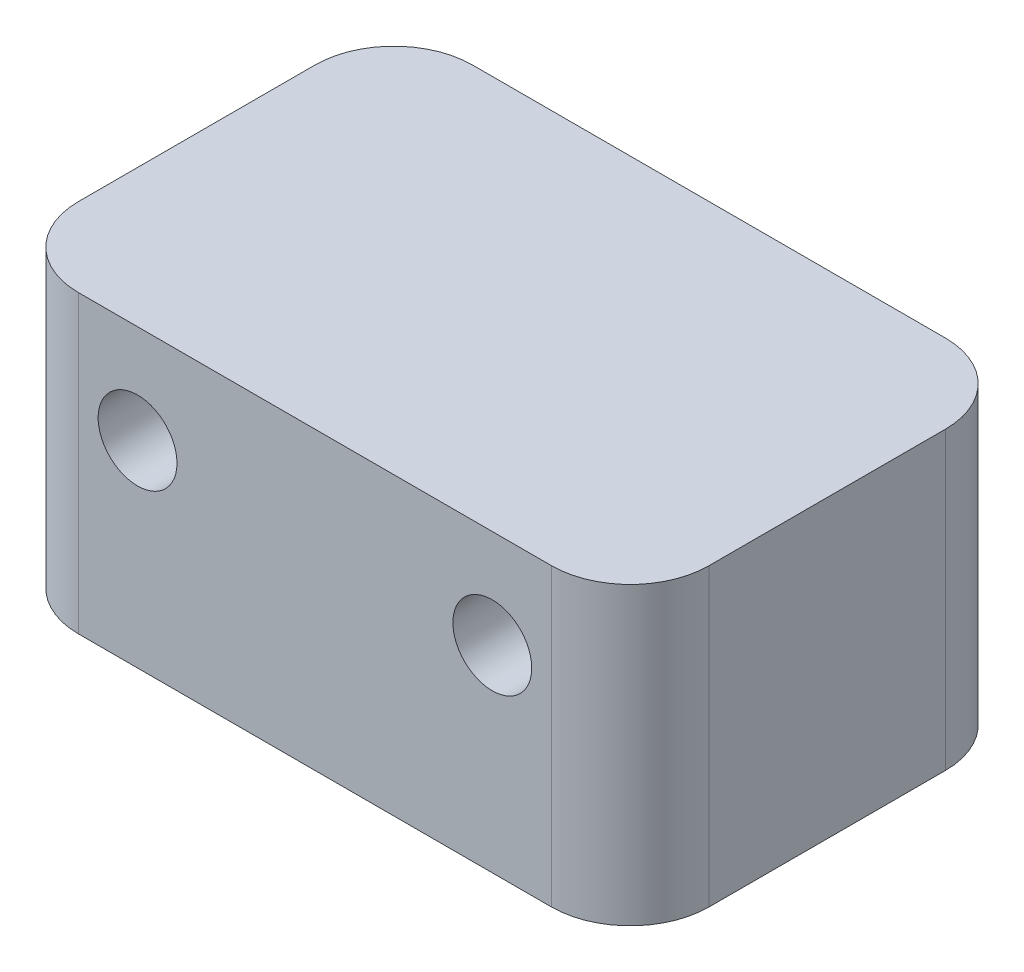
ISO-10303-21;
HEADER;
FILE_DESCRIPTION(('STEP AP214'),'2;1');
FILE_NAME('part.step','',(''),(''),'','','');
FILE_SCHEMA(('AUTOMOTIVE_DESIGN { 1 0 10303 214 1 1 1 1 }'));
ENDSEC;
DATA;
#1=APPLICATION_CONTEXT('core data for automotive mechanical design processes');
#2=APPLICATION_PROTOCOL_DEFINITION('international standard','automotive_design',2000,#1);
#3=PRODUCT_CONTEXT('',#1,'mechanical');
#4=PRODUCT('Part','Part','',(#3));
#5=PRODUCT_RELATED_PRODUCT_CATEGORY('part','',(#4));
#6=PRODUCT_DEFINITION_FORMATION('','',#4);
#7=PRODUCT_DEFINITION_CONTEXT('part definition',#1,'design');
#8=PRODUCT_DEFINITION('design','',#6,#7);
#9=PRODUCT_DEFINITION_SHAPE('','',#8);
#10=(LENGTH_UNIT() NAMED_UNIT(*) SI_UNIT(.MILLI.,.METRE.));
#11=(NAMED_UNIT(*) PLANE_ANGLE_UNIT() SI_UNIT($,.RADIAN.));
#12=(NAMED_UNIT(*) SI_UNIT($,.STERADIAN.) SOLID_ANGLE_UNIT());
#13=UNCERTAINTY_MEASURE_WITH_UNIT(LENGTH_MEASURE(1.E-05),#10,'distance_accuracy_value','');
#14=(GEOMETRIC_REPRESENTATION_CONTEXT(3) GLOBAL_UNCERTAINTY_ASSIGNED_CONTEXT((#13)) GLOBAL_UNIT_ASSIGNED_CONTEXT((#10,
#11,#12)) REPRESENTATION_CONTEXT('',''));
#15=CARTESIAN_POINT('',(0.,0.,0.));
#16=DIRECTION('',(0.,0.,1.));
#17=DIRECTION('',(1.,0.,0.));
#18=AXIS2_PLACEMENT_3D('',#15,#16,#17);
#19=CARTESIAN_POINT('',(0.,15.,0.));
#20=DIRECTION('',(0.,0.,-1.));
#21=DIRECTION('',(-1.,0.,0.));
#22=AXIS2_PLACEMENT_3D('',#19,#20,#21);
#23=PLANE('',#22);
#24=CARTESIAN_POINT('',(-9.,10.,0.));
#25=DIRECTION('',(0.,0.,1.));
#26=DIRECTION('',(1.,0.,0.));
#27=AXIS2_PLACEMENT_3D('',#24,#25,#26);
#28=CIRCLE('',#27,2.);
#29=CARTESIAN_POINT('',(-7.,10.,0.));
#30=VERTEX_POINT('',#29);
#31=EDGE_CURVE('E203',#30,#30,#28,.T.);
#32=ORIENTED_EDGE('',*,*,#31,.F.);
#33=EDGE_LOOP('',(#32));
#34=FACE_BOUND('',#33,.T.);
#35=CARTESIAN_POINT('',(9.,10.,0.));
#36=DIRECTION('',(0.,0.,1.));
#37=DIRECTION('',(1.,0.,0.));
#38=AXIS2_PLACEMENT_3D('',#35,#36,#37);
#39=CIRCLE('',#38,2.);
#40=CARTESIAN_POINT('',(11.,10.,0.));
#41=VERTEX_POINT('',#40);
#42=EDGE_CURVE('E197',#41,#41,#39,.T.);
#43=ORIENTED_EDGE('',*,*,#42,.F.);
#44=EDGE_LOOP('',(#43));
#45=FACE_BOUND('',#44,.T.);
#46=DIRECTION('',(1.,0.,0.));
#47=VECTOR('',#46,1.);
#48=CARTESIAN_POINT('',(0.,15.,0.));
#49=LINE('',#48,#47);
#50=CARTESIAN_POINT('',(-12.,15.,0.));
#51=VERTEX_POINT('',#50);
#52=CARTESIAN_POINT('',(12.,15.,0.));
#53=VERTEX_POINT('',#52);
#54=EDGE_CURVE('E133',#51,#53,#49,.T.);
#55=ORIENTED_EDGE('',*,*,#54,.F.);
#56=DIRECTION('',(0.,-1.,0.));
#57=VECTOR('',#56,1.);
#58=CARTESIAN_POINT('',(-12.,15.,0.));
#59=LINE('',#58,#57);
#60=CARTESIAN_POINT('',(-12.,0.,0.));
#61=VERTEX_POINT('',#60);
#62=EDGE_CURVE('E11',#51,#61,#59,.T.);
#63=ORIENTED_EDGE('',*,*,#62,.T.);
#64=DIRECTION('',(1.,0.,0.));
#65=VECTOR('',#64,1.);
#66=CARTESIAN_POINT('',(0.,0.,0.));
#67=LINE('',#66,#65);
#68=CARTESIAN_POINT('',(12.,0.,0.));
#69=VERTEX_POINT('',#68);
#70=EDGE_CURVE('E164',#61,#69,#67,.T.);
#71=ORIENTED_EDGE('',*,*,#70,.T.);
#72=DIRECTION('',(0.,-1.,0.));
#73=VECTOR('',#72,1.);
#74=CARTESIAN_POINT('',(12.,15.,0.));
#75=LINE('',#74,#73);
#76=EDGE_CURVE('E47',#69,#53,#75,.F.);
#77=ORIENTED_EDGE('',*,*,#76,.T.);
#78=EDGE_LOOP('',(#55,#63,#71,#77));
#79=FACE_BOUND('',#78,.T.);
#80=ADVANCED_FACE('F39',(#34,#45,#79),#23,.F.);
#81=CARTESIAN_POINT('',(16.,15.,-20.));
#82=DIRECTION('',(-1.,0.,0.));
#83=DIRECTION('',(0.,0.,1.));
#84=AXIS2_PLACEMENT_3D('',#81,#82,#83);
#85=PLANE('',#84);
#86=DIRECTION('',(0.,0.,-1.));
#87=VECTOR('',#86,1.);
#88=CARTESIAN_POINT('',(16.,0.,-20.));
#89=LINE('',#88,#87);
#90=CARTESIAN_POINT('',(16.,0.,-4.));
#91=VERTEX_POINT('',#90);
#92=CARTESIAN_POINT('',(16.,0.,-16.));
#93=VERTEX_POINT('',#92);
#94=EDGE_CURVE('E138',#91,#93,#89,.T.);
#95=ORIENTED_EDGE('',*,*,#94,.T.);
#96=DIRECTION('',(0.,-1.,0.));
#97=VECTOR('',#96,1.);
#98=CARTESIAN_POINT('',(16.,15.,-16.));
#99=LINE('',#98,#97);
#100=CARTESIAN_POINT('',(16.,15.,-16.));
#101=VERTEX_POINT('',#100);
#102=EDGE_CURVE('E54',#93,#101,#99,.F.);
#103=ORIENTED_EDGE('',*,*,#102,.T.);
#104=DIRECTION('',(0.,0.,-1.));
#105=VECTOR('',#104,1.);
#106=CARTESIAN_POINT('',(16.,15.,-20.));
#107=LINE('',#106,#105);
#108=CARTESIAN_POINT('',(16.,15.,-4.));
#109=VERTEX_POINT('',#108);
#110=EDGE_CURVE('E136',#109,#101,#107,.T.);
#111=ORIENTED_EDGE('',*,*,#110,.F.);
#112=DIRECTION('',(0.,-1.,0.));
#113=VECTOR('',#112,1.);
#114=CARTESIAN_POINT('',(16.,15.,-4.));
#115=LINE('',#114,#113);
#116=EDGE_CURVE('E156',#109,#91,#115,.T.);
#117=ORIENTED_EDGE('',*,*,#116,.T.);
#118=EDGE_LOOP('',(#95,#103,#111,#117));
#119=FACE_BOUND('',#118,.T.);
#120=ADVANCED_FACE('F171',(#119),#85,.F.);
#121=CARTESIAN_POINT('',(-16.,15.,-20.));
#122=DIRECTION('',(0.,0.,1.));
#123=DIRECTION('',(1.,0.,0.));
#124=AXIS2_PLACEMENT_3D('',#121,#122,#123);
#125=PLANE('',#124);
#126=DIRECTION('',(-1.,0.,0.));
#127=VECTOR('',#126,1.);
#128=CARTESIAN_POINT('',(-16.,0.,-20.));
#129=LINE('',#128,#127);
#130=CARTESIAN_POINT('',(12.,0.,-20.));
#131=VERTEX_POINT('',#130);
#132=CARTESIAN_POINT('',(-12.,0.,-20.));
#133=VERTEX_POINT('',#132);
#134=EDGE_CURVE('E134',#131,#133,#129,.T.);
#135=ORIENTED_EDGE('',*,*,#134,.T.);
#136=DIRECTION('',(0.,-1.,0.));
#137=VECTOR('',#136,1.);
#138=CARTESIAN_POINT('',(-12.,15.,-20.));
#139=LINE('',#138,#137);
#140=CARTESIAN_POINT('',(-12.,15.,-20.));
#141=VERTEX_POINT('',#140);
#142=EDGE_CURVE('E111',#133,#141,#139,.F.);
#143=ORIENTED_EDGE('',*,*,#142,.T.);
#144=DIRECTION('',(-1.,0.,0.));
#145=VECTOR('',#144,1.);
#146=CARTESIAN_POINT('',(-16.,15.,-20.));
#147=LINE('',#146,#145);
#148=CARTESIAN_POINT('',(12.,15.,-20.));
#149=VERTEX_POINT('',#148);
#150=EDGE_CURVE('E176',#149,#141,#147,.T.);
#151=ORIENTED_EDGE('',*,*,#150,.F.);
#152=DIRECTION('',(0.,-1.,0.));
#153=VECTOR('',#152,1.);
#154=CARTESIAN_POINT('',(12.,15.,-20.));
#155=LINE('',#154,#153);
#156=EDGE_CURVE('E116',#149,#131,#155,.T.);
#157=ORIENTED_EDGE('',*,*,#156,.T.);
#158=EDGE_LOOP('',(#135,#143,#151,#157));
#159=FACE_BOUND('',#158,.T.);
#160=ADVANCED_FACE('F265',(#159),#125,.F.);
#161=CARTESIAN_POINT('',(-16.,15.,0.));
#162=DIRECTION('',(1.,0.,0.));
#163=DIRECTION('',(0.,0.,-1.));
#164=AXIS2_PLACEMENT_3D('',#161,#162,#163);
#165=PLANE('',#164);
#166=DIRECTION('',(0.,0.,1.));
#167=VECTOR('',#166,1.);
#168=CARTESIAN_POINT('',(-16.,15.,0.));
#169=LINE('',#168,#167);
#170=CARTESIAN_POINT('',(-16.,15.,-16.));
#171=VERTEX_POINT('',#170);
#172=CARTESIAN_POINT('',(-16.,15.,-4.));
#173=VERTEX_POINT('',#172);
#174=EDGE_CURVE('E126',#171,#173,#169,.T.);
#175=ORIENTED_EDGE('',*,*,#174,.F.);
#176=DIRECTION('',(0.,-1.,0.));
#177=VECTOR('',#176,1.);
#178=CARTESIAN_POINT('',(-16.,15.,-16.));
#179=LINE('',#178,#177);
#180=CARTESIAN_POINT('',(-16.,0.,-16.));
#181=VERTEX_POINT('',#180);
#182=EDGE_CURVE('E110',#171,#181,#179,.T.);
#183=ORIENTED_EDGE('',*,*,#182,.T.);
#184=DIRECTION('',(0.,0.,1.));
#185=VECTOR('',#184,1.);
#186=CARTESIAN_POINT('',(-16.,0.,0.));
#187=LINE('',#186,#185);
#188=CARTESIAN_POINT('',(-16.,0.,-4.));
#189=VERTEX_POINT('',#188);
#190=EDGE_CURVE('E123',#181,#189,#187,.T.);
#191=ORIENTED_EDGE('',*,*,#190,.T.);
#192=DIRECTION('',(0.,-1.,0.));
#193=VECTOR('',#192,1.);
#194=CARTESIAN_POINT('',(-16.,15.,-4.));
#195=LINE('',#194,#193);
#196=EDGE_CURVE('E128',#189,#173,#195,.F.);
#197=ORIENTED_EDGE('',*,*,#196,.T.);
#198=EDGE_LOOP('',(#175,#183,#191,#197));
#199=FACE_BOUND('',#198,.T.);
#200=ADVANCED_FACE('F122',(#199),#165,.F.);
#201=CARTESIAN_POINT('',(0.,15.,0.));
#202=DIRECTION('',(0.,-1.,0.));
#203=DIRECTION('',(0.,0.,-1.));
#204=AXIS2_PLACEMENT_3D('',#201,#202,#203);
#205=PLANE('',#204);
#206=ORIENTED_EDGE('',*,*,#150,.T.);
#207=CARTESIAN_POINT('',(-12.,15.,-16.));
#208=DIRECTION('',(0.,-1.,0.));
#209=DIRECTION('',(0.,0.,-1.));
#210=AXIS2_PLACEMENT_3D('',#207,#208,#209);
#211=CIRCLE('',#210,4.);
#212=EDGE_CURVE('E154',#141,#171,#211,.F.);
#213=ORIENTED_EDGE('',*,*,#212,.T.);
#214=ORIENTED_EDGE('',*,*,#174,.T.);
#215=CARTESIAN_POINT('',(-12.,15.,-4.));
#216=DIRECTION('',(0.,-1.,0.));
#217=DIRECTION('',(0.,0.,-1.));
#218=AXIS2_PLACEMENT_3D('',#215,#216,#217);
#219=CIRCLE('',#218,4.);
#220=EDGE_CURVE('E150',#173,#51,#219,.F.);
#221=ORIENTED_EDGE('',*,*,#220,.T.);
#222=ORIENTED_EDGE('',*,*,#54,.T.);
#223=CARTESIAN_POINT('',(12.,15.,-4.));
#224=DIRECTION('',(0.,-1.,0.));
#225=DIRECTION('',(0.,0.,-1.));
#226=AXIS2_PLACEMENT_3D('',#223,#224,#225);
#227=CIRCLE('',#226,4.);
#228=EDGE_CURVE('E61',#53,#109,#227,.F.);
#229=ORIENTED_EDGE('',*,*,#228,.T.);
#230=ORIENTED_EDGE('',*,*,#110,.T.);
#231=CARTESIAN_POINT('',(12.,15.,-16.));
#232=DIRECTION('',(0.,-1.,0.));
#233=DIRECTION('',(0.,0.,-1.));
#234=AXIS2_PLACEMENT_3D('',#231,#232,#233);
#235=CIRCLE('',#234,4.);
#236=EDGE_CURVE('E152',#101,#149,#235,.F.);
#237=ORIENTED_EDGE('',*,*,#236,.T.);
#238=EDGE_LOOP('',(#206,#213,#214,#221,#222,#229,#230,#237));
#239=FACE_BOUND('',#238,.T.);
#240=ADVANCED_FACE('F167',(#239),#205,.F.);
#241=CARTESIAN_POINT('',(0.,0.,0.));
#242=DIRECTION('',(0.,-1.,0.));
#243=DIRECTION('',(0.,0.,-1.));
#244=AXIS2_PLACEMENT_3D('',#241,#242,#243);
#245=PLANE('',#244);
#246=CARTESIAN_POINT('',(-10.,0.,-15.));
#247=DIRECTION('',(0.,-1.,0.));
#248=DIRECTION('',(0.,0.,-1.));
#249=AXIS2_PLACEMENT_3D('',#246,#247,#248);
#250=CIRCLE('',#249,2.);
#251=CARTESIAN_POINT('',(-10.,0.,-17.));
#252=VERTEX_POINT('',#251);
#253=EDGE_CURVE('E192',#252,#252,#250,.T.);
#254=ORIENTED_EDGE('',*,*,#253,.F.);
#255=EDGE_LOOP('',(#254));
#256=FACE_BOUND('',#255,.T.);
#257=CARTESIAN_POINT('',(10.,0.,-15.));
#258=DIRECTION('',(0.,-1.,0.));
#259=DIRECTION('',(0.,0.,-1.));
#260=AXIS2_PLACEMENT_3D('',#257,#258,#259);
#261=CIRCLE('',#260,2.);
#262=CARTESIAN_POINT('',(10.,0.,-17.));
#263=VERTEX_POINT('',#262);
#264=EDGE_CURVE('E186',#263,#263,#261,.T.);
#265=ORIENTED_EDGE('',*,*,#264,.F.);
#266=EDGE_LOOP('',(#265));
#267=FACE_BOUND('',#266,.T.);
#268=CARTESIAN_POINT('',(0.,0.,-5.));
#269=DIRECTION('',(0.,-1.,0.));
#270=DIRECTION('',(0.,0.,-1.));
#271=AXIS2_PLACEMENT_3D('',#268,#269,#270);
#272=CIRCLE('',#271,2.);
#273=CARTESIAN_POINT('',(0.,0.,-7.));
#274=VERTEX_POINT('',#273);
#275=EDGE_CURVE('E179',#274,#274,#272,.T.);
#276=ORIENTED_EDGE('',*,*,#275,.F.);
#277=EDGE_LOOP('',(#276));
#278=FACE_BOUND('',#277,.T.);
#279=ORIENTED_EDGE('',*,*,#190,.F.);
#280=CARTESIAN_POINT('',(-12.,0.,-16.));
#281=DIRECTION('',(0.,-1.,0.));
#282=DIRECTION('',(0.,0.,-1.));
#283=AXIS2_PLACEMENT_3D('',#280,#281,#282);
#284=CIRCLE('',#283,4.);
#285=EDGE_CURVE('E106',#181,#133,#284,.T.);
#286=ORIENTED_EDGE('',*,*,#285,.T.);
#287=ORIENTED_EDGE('',*,*,#134,.F.);
#288=CARTESIAN_POINT('',(12.,0.,-16.));
#289=DIRECTION('',(0.,-1.,0.));
#290=DIRECTION('',(0.,0.,-1.));
#291=AXIS2_PLACEMENT_3D('',#288,#289,#290);
#292=CIRCLE('',#291,4.);
#293=EDGE_CURVE('E117',#131,#93,#292,.T.);
#294=ORIENTED_EDGE('',*,*,#293,.T.);
#295=ORIENTED_EDGE('',*,*,#94,.F.);
#296=CARTESIAN_POINT('',(12.,0.,-4.));
#297=DIRECTION('',(0.,-1.,0.));
#298=DIRECTION('',(0.,0.,-1.));
#299=AXIS2_PLACEMENT_3D('',#296,#297,#298);
#300=CIRCLE('',#299,4.);
#301=EDGE_CURVE('E127',#91,#69,#300,.T.);
#302=ORIENTED_EDGE('',*,*,#301,.T.);
#303=ORIENTED_EDGE('',*,*,#70,.F.);
#304=CARTESIAN_POINT('',(-12.,0.,-4.));
#305=DIRECTION('',(0.,-1.,0.));
#306=DIRECTION('',(0.,0.,-1.));
#307=AXIS2_PLACEMENT_3D('',#304,#305,#306);
#308=CIRCLE('',#307,4.);
#309=EDGE_CURVE('E132',#61,#189,#308,.T.);
#310=ORIENTED_EDGE('',*,*,#309,.T.);
#311=EDGE_LOOP('',(#279,#286,#287,#294,#295,#302,#303,#310));
#312=FACE_BOUND('',#311,.T.);
#313=ADVANCED_FACE('F130',(#256,#267,#278,#312),#245,.T.);
#314=CARTESIAN_POINT('',(-12.,15.,-16.));
#315=DIRECTION('',(0.,-1.,0.));
#316=DIRECTION('',(0.,0.,-1.));
#317=AXIS2_PLACEMENT_3D('',#314,#315,#316);
#318=CYLINDRICAL_SURFACE('',#317,4.);
#319=ORIENTED_EDGE('',*,*,#212,.F.);
#320=ORIENTED_EDGE('',*,*,#142,.F.);
#321=ORIENTED_EDGE('',*,*,#285,.F.);
#322=ORIENTED_EDGE('',*,*,#182,.F.);
#323=EDGE_LOOP('',(#319,#320,#321,#322));
#324=FACE_BOUND('',#323,.T.);
#325=ADVANCED_FACE('F109',(#324),#318,.T.);
#326=CARTESIAN_POINT('',(12.,15.,-16.));
#327=DIRECTION('',(0.,-1.,0.));
#328=DIRECTION('',(0.,0.,-1.));
#329=AXIS2_PLACEMENT_3D('',#326,#327,#328);
#330=CYLINDRICAL_SURFACE('',#329,4.);
#331=ORIENTED_EDGE('',*,*,#236,.F.);
#332=ORIENTED_EDGE('',*,*,#102,.F.);
#333=ORIENTED_EDGE('',*,*,#293,.F.);
#334=ORIENTED_EDGE('',*,*,#156,.F.);
#335=EDGE_LOOP('',(#331,#332,#333,#334));
#336=FACE_BOUND('',#335,.T.);
#337=ADVANCED_FACE('F273',(#336),#330,.T.);
#338=CARTESIAN_POINT('',(-12.,15.,-4.));
#339=DIRECTION('',(0.,-1.,0.));
#340=DIRECTION('',(0.,0.,-1.));
#341=AXIS2_PLACEMENT_3D('',#338,#339,#340);
#342=CYLINDRICAL_SURFACE('',#341,4.);
#343=ORIENTED_EDGE('',*,*,#220,.F.);
#344=ORIENTED_EDGE('',*,*,#196,.F.);
#345=ORIENTED_EDGE('',*,*,#309,.F.);
#346=ORIENTED_EDGE('',*,*,#62,.F.);
#347=EDGE_LOOP('',(#343,#344,#345,#346));
#348=FACE_BOUND('',#347,.T.);
#349=ADVANCED_FACE('F275',(#348),#342,.T.);
#350=CARTESIAN_POINT('',(12.,15.,-4.));
#351=DIRECTION('',(0.,-1.,0.));
#352=DIRECTION('',(0.,0.,-1.));
#353=AXIS2_PLACEMENT_3D('',#350,#351,#352);
#354=CYLINDRICAL_SURFACE('',#353,4.);
#355=ORIENTED_EDGE('',*,*,#228,.F.);
#356=ORIENTED_EDGE('',*,*,#76,.F.);
#357=ORIENTED_EDGE('',*,*,#301,.F.);
#358=ORIENTED_EDGE('',*,*,#116,.F.);
#359=EDGE_LOOP('',(#355,#356,#357,#358));
#360=FACE_BOUND('',#359,.T.);
#361=ADVANCED_FACE('F41',(#360),#354,.T.);
#362=CARTESIAN_POINT('',(0.,12.,-5.));
#363=DIRECTION('',(0.,-1.,0.));
#364=DIRECTION('',(0.,0.,-1.));
#365=AXIS2_PLACEMENT_3D('',#362,#363,#364);
#366=CYLINDRICAL_SURFACE('',#365,2.);
#367=CARTESIAN_POINT('',(0.,12.,-5.));
#368=DIRECTION('',(0.,-1.,0.));
#369=DIRECTION('',(0.,0.,-1.));
#370=AXIS2_PLACEMENT_3D('',#367,#368,#369);
#371=CIRCLE('',#370,2.);
#372=CARTESIAN_POINT('',(0.,12.,-7.));
#373=VERTEX_POINT('',#372);
#374=EDGE_CURVE('E182',#373,#373,#371,.T.);
#375=ORIENTED_EDGE('',*,*,#374,.F.);
#376=EDGE_LOOP('',(#375));
#377=FACE_BOUND('',#376,.T.);
#378=ORIENTED_EDGE('',*,*,#275,.T.);
#379=EDGE_LOOP('',(#378));
#380=FACE_BOUND('',#379,.T.);
#381=ADVANCED_FACE('F253',(#377,#380),#366,.F.);
#382=CARTESIAN_POINT('',(0.,12.,-5.));
#383=DIRECTION('',(0.,-1.,0.));
#384=DIRECTION('',(0.,0.,-1.));
#385=AXIS2_PLACEMENT_3D('',#382,#383,#384);
#386=PLANE('',#385);
#387=ORIENTED_EDGE('',*,*,#374,.T.);
#388=EDGE_LOOP('',(#387));
#389=FACE_BOUND('',#388,.T.);
#390=ADVANCED_FACE('F249',(#389),#386,.T.);
#391=CARTESIAN_POINT('',(10.,12.,-15.));
#392=DIRECTION('',(0.,-1.,0.));
#393=DIRECTION('',(0.,0.,-1.));
#394=AXIS2_PLACEMENT_3D('',#391,#392,#393);
#395=CYLINDRICAL_SURFACE('',#394,2.);
#396=CARTESIAN_POINT('',(10.,12.,-15.));
#397=DIRECTION('',(0.,-1.,0.));
#398=DIRECTION('',(0.,0.,-1.));
#399=AXIS2_PLACEMENT_3D('',#396,#397,#398);
#400=CIRCLE('',#399,2.);
#401=CARTESIAN_POINT('',(10.,12.,-17.));
#402=VERTEX_POINT('',#401);
#403=EDGE_CURVE('E189',#402,#402,#400,.T.);
#404=ORIENTED_EDGE('',*,*,#403,.F.);
#405=EDGE_LOOP('',(#404));
#406=FACE_BOUND('',#405,.T.);
#407=ORIENTED_EDGE('',*,*,#264,.T.);
#408=EDGE_LOOP('',(#407));
#409=FACE_BOUND('',#408,.T.);
#410=ADVANCED_FACE('F245',(#406,#409),#395,.F.);
#411=CARTESIAN_POINT('',(10.,12.,-15.));
#412=DIRECTION('',(0.,-1.,0.));
#413=DIRECTION('',(0.,0.,-1.));
#414=AXIS2_PLACEMENT_3D('',#411,#412,#413);
#415=PLANE('',#414);
#416=ORIENTED_EDGE('',*,*,#403,.T.);
#417=EDGE_LOOP('',(#416));
#418=FACE_BOUND('',#417,.T.);
#419=ADVANCED_FACE('F241',(#418),#415,.T.);
#420=CARTESIAN_POINT('',(-10.,12.,-15.));
#421=DIRECTION('',(0.,-1.,0.));
#422=DIRECTION('',(0.,0.,-1.));
#423=AXIS2_PLACEMENT_3D('',#420,#421,#422);
#424=CYLINDRICAL_SURFACE('',#423,2.);
#425=CARTESIAN_POINT('',(-10.,12.,-15.));
#426=DIRECTION('',(0.,-1.,0.));
#427=DIRECTION('',(0.,0.,-1.));
#428=AXIS2_PLACEMENT_3D('',#425,#426,#427);
#429=CIRCLE('',#428,2.);
#430=CARTESIAN_POINT('',(-10.,12.,-17.));
#431=VERTEX_POINT('',#430);
#432=EDGE_CURVE('E172',#431,#431,#429,.T.);
#433=ORIENTED_EDGE('',*,*,#432,.F.);
#434=EDGE_LOOP('',(#433));
#435=FACE_BOUND('',#434,.T.);
#436=ORIENTED_EDGE('',*,*,#253,.T.);
#437=EDGE_LOOP('',(#436));
#438=FACE_BOUND('',#437,.T.);
#439=ADVANCED_FACE('F234',(#435,#438),#424,.F.);
#440=CARTESIAN_POINT('',(-10.,12.,-15.));
#441=DIRECTION('',(0.,-1.,0.));
#442=DIRECTION('',(0.,0.,-1.));
#443=AXIS2_PLACEMENT_3D('',#440,#441,#442);
#444=PLANE('',#443);
#445=ORIENTED_EDGE('',*,*,#432,.T.);
#446=EDGE_LOOP('',(#445));
#447=FACE_BOUND('',#446,.T.);
#448=ADVANCED_FACE('F225',(#447),#444,.T.);
#449=CARTESIAN_POINT('',(9.,10.,-12.));
#450=DIRECTION('',(0.,0.,1.));
#451=DIRECTION('',(1.,0.,0.));
#452=AXIS2_PLACEMENT_3D('',#449,#450,#451);
#453=CYLINDRICAL_SURFACE('',#452,2.);
#454=CARTESIAN_POINT('',(9.,10.,-12.));
#455=DIRECTION('',(0.,0.,1.));
#456=DIRECTION('',(1.,0.,0.));
#457=AXIS2_PLACEMENT_3D('',#454,#455,#456);
#458=CIRCLE('',#457,2.);
#459=CARTESIAN_POINT('',(11.,10.,-12.));
#460=VERTEX_POINT('',#459);
#461=EDGE_CURVE('E200',#460,#460,#458,.T.);
#462=ORIENTED_EDGE('',*,*,#461,.F.);
#463=EDGE_LOOP('',(#462));
#464=FACE_BOUND('',#463,.T.);
#465=ORIENTED_EDGE('',*,*,#42,.T.);
#466=EDGE_LOOP('',(#465));
#467=FACE_BOUND('',#466,.T.);
#468=ADVANCED_FACE('F223',(#464,#467),#453,.F.);
#469=CARTESIAN_POINT('',(9.,10.,-12.));
#470=DIRECTION('',(0.,0.,1.));
#471=DIRECTION('',(1.,0.,0.));
#472=AXIS2_PLACEMENT_3D('',#469,#470,#471);
#473=PLANE('',#472);
#474=ORIENTED_EDGE('',*,*,#461,.T.);
#475=EDGE_LOOP('',(#474));
#476=FACE_BOUND('',#475,.T.);
#477=ADVANCED_FACE('F214',(#476),#473,.T.);
#478=CARTESIAN_POINT('',(-9.,10.,-12.));
#479=DIRECTION('',(0.,0.,1.));
#480=DIRECTION('',(1.,0.,0.));
#481=AXIS2_PLACEMENT_3D('',#478,#479,#480);
#482=CYLINDRICAL_SURFACE('',#481,2.);
#483=CARTESIAN_POINT('',(-9.,10.,-12.));
#484=DIRECTION('',(0.,0.,1.));
#485=DIRECTION('',(1.,0.,0.));
#486=AXIS2_PLACEMENT_3D('',#483,#484,#485);
#487=CIRCLE('',#486,2.);
#488=CARTESIAN_POINT('',(-7.,10.,-12.));
#489=VERTEX_POINT('',#488);
#490=EDGE_CURVE('E183',#489,#489,#487,.T.);
#491=ORIENTED_EDGE('',*,*,#490,.F.);
#492=EDGE_LOOP('',(#491));
#493=FACE_BOUND('',#492,.T.);
#494=ORIENTED_EDGE('',*,*,#31,.T.);
#495=EDGE_LOOP('',(#494));
#496=FACE_BOUND('',#495,.T.);
#497=ADVANCED_FACE('F211',(#493,#496),#482,.F.);
#498=CARTESIAN_POINT('',(-9.,10.,-12.));
#499=DIRECTION('',(0.,0.,1.));
#500=DIRECTION('',(1.,0.,0.));
#501=AXIS2_PLACEMENT_3D('',#498,#499,#500);
#502=PLANE('',#501);
#503=ORIENTED_EDGE('',*,*,#490,.T.);
#504=EDGE_LOOP('',(#503));
#505=FACE_BOUND('',#504,.T.);
#506=ADVANCED_FACE('F209',(#505),#502,.T.);
#507=CLOSED_SHELL('',(#80,#120,#160,#200,#240,#313,#325,#337,#349,#361,#381,#390,#410,#419,#439,
#448,#468,#477,#497,#506));
#508=MANIFOLD_SOLID_BREP('B2',#507);
#509=ADVANCED_BREP_SHAPE_REPRESENTATION('',(#18,#508),#14);
#510=SHAPE_DEFINITION_REPRESENTATION(#9,#509);
ENDSEC;
END-ISO-10303-21;
